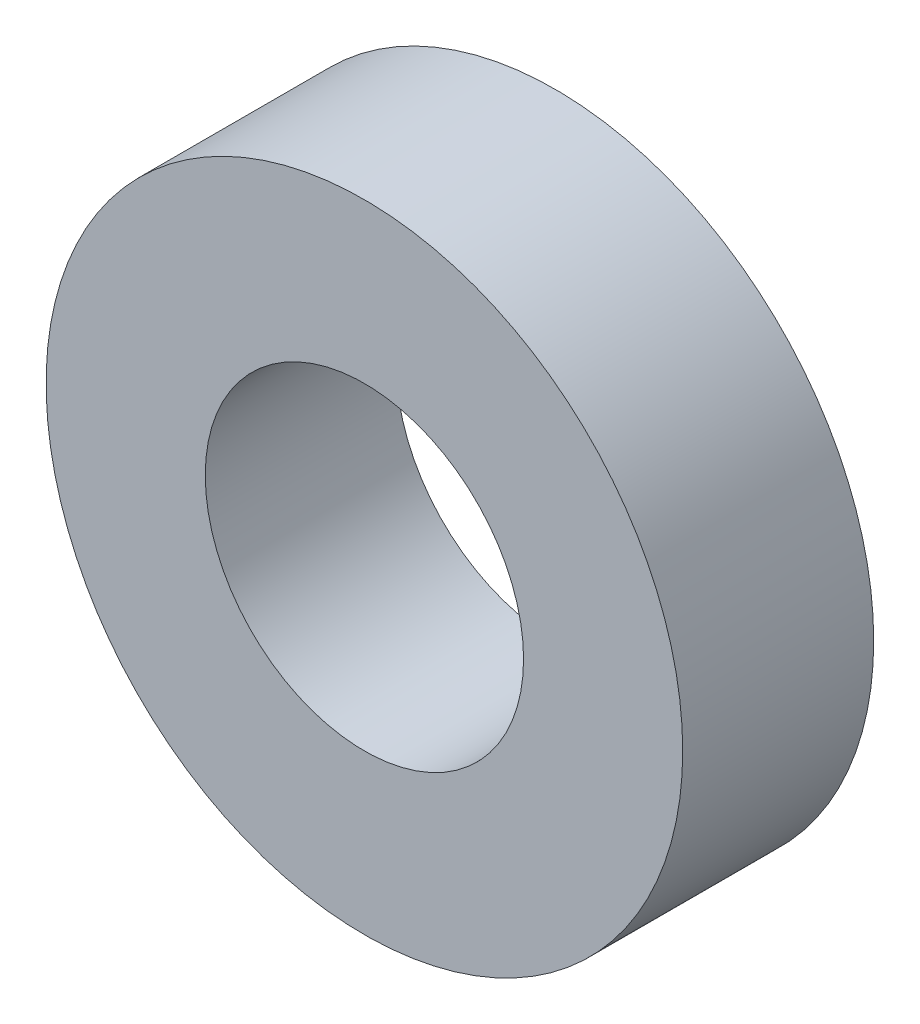
ISO-10303-21;
HEADER;
FILE_DESCRIPTION(('STEP AP214'),'2;1');
FILE_NAME('part.step','',(''),(''),'','','');
FILE_SCHEMA(('AUTOMOTIVE_DESIGN { 1 0 10303 214 1 1 1 1 }'));
ENDSEC;
DATA;
#1=APPLICATION_CONTEXT('core data for automotive mechanical design processes');
#2=APPLICATION_PROTOCOL_DEFINITION('international standard','automotive_design',2000,#1);
#3=PRODUCT_CONTEXT('',#1,'mechanical');
#4=PRODUCT('Part','Part','',(#3));
#5=PRODUCT_RELATED_PRODUCT_CATEGORY('part','',(#4));
#6=PRODUCT_DEFINITION_FORMATION('','',#4);
#7=PRODUCT_DEFINITION_CONTEXT('part definition',#1,'design');
#8=PRODUCT_DEFINITION('design','',#6,#7);
#9=PRODUCT_DEFINITION_SHAPE('','',#8);
#10=(LENGTH_UNIT() NAMED_UNIT(*) SI_UNIT(.MILLI.,.METRE.));
#11=(NAMED_UNIT(*) PLANE_ANGLE_UNIT() SI_UNIT($,.RADIAN.));
#12=(NAMED_UNIT(*) SI_UNIT($,.STERADIAN.) SOLID_ANGLE_UNIT());
#13=UNCERTAINTY_MEASURE_WITH_UNIT(LENGTH_MEASURE(1.E-05),#10,'distance_accuracy_value','');
#14=(GEOMETRIC_REPRESENTATION_CONTEXT(3) GLOBAL_UNCERTAINTY_ASSIGNED_CONTEXT((#13)) GLOBAL_UNIT_ASSIGNED_CONTEXT((#10,
#11,#12)) REPRESENTATION_CONTEXT('',''));
#15=CARTESIAN_POINT('',(0.,0.,0.));
#16=DIRECTION('',(0.,0.,1.));
#17=DIRECTION('',(1.,0.,0.));
#18=AXIS2_PLACEMENT_3D('',#15,#16,#17);
#19=CARTESIAN_POINT('',(0.,0.,30.));
#20=DIRECTION('',(0.,0.,1.));
#21=DIRECTION('',(1.,0.,0.));
#22=AXIS2_PLACEMENT_3D('',#19,#20,#21);
#23=PLANE('',#22);
#24=CARTESIAN_POINT('',(0.,0.,30.));
#25=DIRECTION('',(0.,0.,1.));
#26=DIRECTION('',(1.,0.,0.));
#27=AXIS2_PLACEMENT_3D('',#24,#25,#26);
#28=CIRCLE('',#27,50.);
#29=CARTESIAN_POINT('',(50.,0.,30.));
#30=VERTEX_POINT('',#29);
#31=EDGE_CURVE('E10',#30,#30,#28,.T.);
#32=ORIENTED_EDGE('',*,*,#31,.T.);
#33=EDGE_LOOP('',(#32));
#34=FACE_BOUND('',#33,.T.);
#35=CARTESIAN_POINT('',(0.,0.,30.));
#36=DIRECTION('',(0.,0.,1.));
#37=DIRECTION('',(1.,0.,0.));
#38=AXIS2_PLACEMENT_3D('',#35,#36,#37);
#39=CIRCLE('',#38,25.);
#40=CARTESIAN_POINT('',(25.,0.,30.));
#41=VERTEX_POINT('',#40);
#42=EDGE_CURVE('E48',#41,#41,#39,.T.);
#43=ORIENTED_EDGE('',*,*,#42,.F.);
#44=EDGE_LOOP('',(#43));
#45=FACE_BOUND('',#44,.T.);
#46=ADVANCED_FACE('F37',(#34,#45),#23,.T.);
#47=CARTESIAN_POINT('',(0.,0.,0.));
#48=DIRECTION('',(0.,0.,1.));
#49=DIRECTION('',(1.,0.,0.));
#50=AXIS2_PLACEMENT_3D('',#47,#48,#49);
#51=PLANE('',#50);
#52=CARTESIAN_POINT('',(0.,0.,0.));
#53=DIRECTION('',(0.,0.,1.));
#54=DIRECTION('',(1.,0.,0.));
#55=AXIS2_PLACEMENT_3D('',#52,#53,#54);
#56=CIRCLE('',#55,50.);
#57=CARTESIAN_POINT('',(50.,0.,0.));
#58=VERTEX_POINT('',#57);
#59=EDGE_CURVE('E41',#58,#58,#56,.T.);
#60=ORIENTED_EDGE('',*,*,#59,.F.);
#61=EDGE_LOOP('',(#60));
#62=FACE_BOUND('',#61,.T.);
#63=CARTESIAN_POINT('',(0.,0.,0.));
#64=DIRECTION('',(0.,0.,1.));
#65=DIRECTION('',(1.,0.,0.));
#66=AXIS2_PLACEMENT_3D('',#63,#64,#65);
#67=CIRCLE('',#66,25.);
#68=CARTESIAN_POINT('',(25.,0.,0.));
#69=VERTEX_POINT('',#68);
#70=EDGE_CURVE('E50',#69,#69,#67,.T.);
#71=ORIENTED_EDGE('',*,*,#70,.T.);
#72=EDGE_LOOP('',(#71));
#73=FACE_BOUND('',#72,.T.);
#74=ADVANCED_FACE('F60',(#62,#73),#51,.F.);
#75=CARTESIAN_POINT('',(0.,0.,30.));
#76=DIRECTION('',(0.,0.,-1.));
#77=DIRECTION('',(-1.,0.,0.));
#78=AXIS2_PLACEMENT_3D('',#75,#76,#77);
#79=CYLINDRICAL_SURFACE('',#78,50.);
#80=ORIENTED_EDGE('',*,*,#31,.F.);
#81=EDGE_LOOP('',(#80));
#82=FACE_BOUND('',#81,.T.);
#83=ORIENTED_EDGE('',*,*,#59,.T.);
#84=EDGE_LOOP('',(#83));
#85=FACE_BOUND('',#84,.T.);
#86=ADVANCED_FACE('F39',(#82,#85),#79,.T.);
#87=CARTESIAN_POINT('',(0.,0.,30.));
#88=DIRECTION('',(0.,0.,-1.));
#89=DIRECTION('',(-1.,0.,0.));
#90=AXIS2_PLACEMENT_3D('',#87,#88,#89);
#91=CYLINDRICAL_SURFACE('',#90,25.);
#92=ORIENTED_EDGE('',*,*,#42,.T.);
#93=EDGE_LOOP('',(#92));
#94=FACE_BOUND('',#93,.T.);
#95=ORIENTED_EDGE('',*,*,#70,.F.);
#96=EDGE_LOOP('',(#95));
#97=FACE_BOUND('',#96,.T.);
#98=ADVANCED_FACE('F56',(#94,#97),#91,.F.);
#99=CLOSED_SHELL('',(#46,#74,#86,#98));
#100=MANIFOLD_SOLID_BREP('B2',#99);
#101=ADVANCED_BREP_SHAPE_REPRESENTATION('',(#18,#100),#14);
#102=SHAPE_DEFINITION_REPRESENTATION(#9,#101);
ENDSEC;
END-ISO-10303-21;
